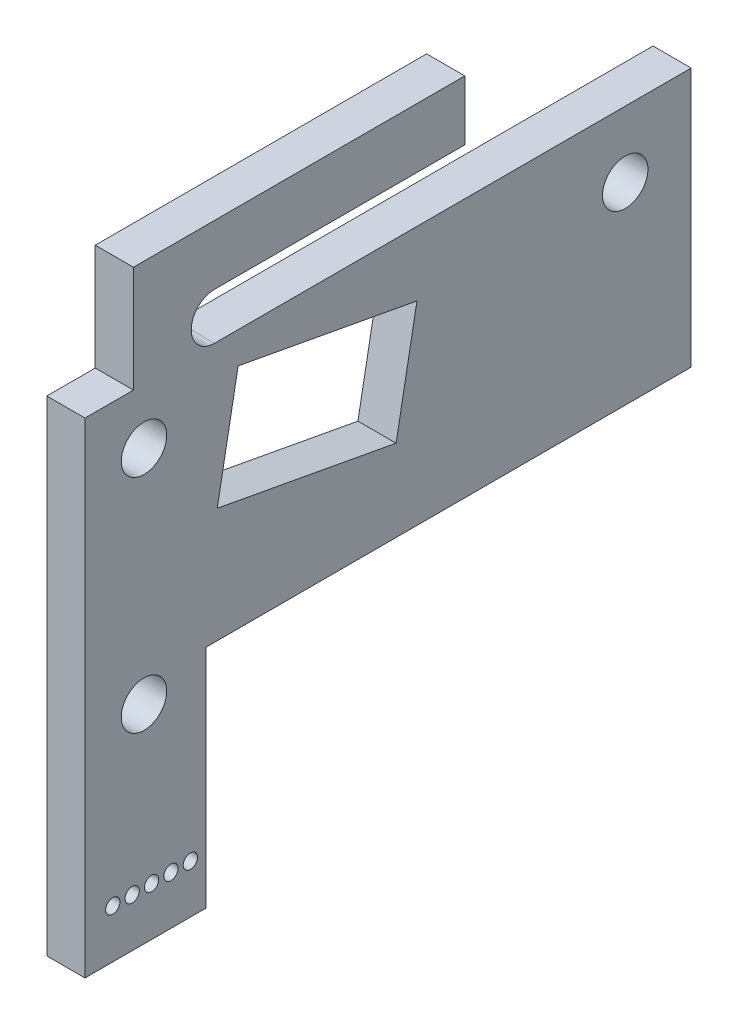
ISO-10303-21;
HEADER;
FILE_DESCRIPTION(('STEP AP214'),'2;1');
FILE_NAME('part.step','',(''),(''),'','','');
FILE_SCHEMA(('AUTOMOTIVE_DESIGN { 1 0 10303 214 1 1 1 1 }'));
ENDSEC;
DATA;
#1=APPLICATION_CONTEXT('core data for automotive mechanical design processes');
#2=APPLICATION_PROTOCOL_DEFINITION('international standard','automotive_design',2000,#1);
#3=PRODUCT_CONTEXT('',#1,'mechanical');
#4=PRODUCT('Part','Part','',(#3));
#5=PRODUCT_RELATED_PRODUCT_CATEGORY('part','',(#4));
#6=PRODUCT_DEFINITION_FORMATION('','',#4);
#7=PRODUCT_DEFINITION_CONTEXT('part definition',#1,'design');
#8=PRODUCT_DEFINITION('design','',#6,#7);
#9=PRODUCT_DEFINITION_SHAPE('','',#8);
#10=(LENGTH_UNIT() NAMED_UNIT(*) SI_UNIT(.MILLI.,.METRE.));
#11=(NAMED_UNIT(*) PLANE_ANGLE_UNIT() SI_UNIT($,.RADIAN.));
#12=(NAMED_UNIT(*) SI_UNIT($,.STERADIAN.) SOLID_ANGLE_UNIT());
#13=UNCERTAINTY_MEASURE_WITH_UNIT(LENGTH_MEASURE(1.E-05),#10,'distance_accuracy_value','');
#14=(GEOMETRIC_REPRESENTATION_CONTEXT(3) GLOBAL_UNCERTAINTY_ASSIGNED_CONTEXT((#13)) GLOBAL_UNIT_ASSIGNED_CONTEXT((#10,
#11,#12)) REPRESENTATION_CONTEXT('',''));
#15=CARTESIAN_POINT('',(0.,0.,0.));
#16=DIRECTION('',(0.,0.,1.));
#17=DIRECTION('',(1.,0.,0.));
#18=AXIS2_PLACEMENT_3D('',#15,#16,#17);
#19=CARTESIAN_POINT('',(2.,9.35346234385972,43.0185350255957));
#20=DIRECTION('',(-1.,0.,0.));
#21=DIRECTION('',(0.,0.,1.));
#22=AXIS2_PLACEMENT_3D('',#19,#20,#21);
#23=PLANE('',#22);
#24=CARTESIAN_POINT('',(2.,-38.8104127217883,53.6809582242048));
#25=DIRECTION('',(1.,0.,0.));
#26=DIRECTION('',(0.,0.,-1.));
#27=AXIS2_PLACEMENT_3D('',#24,#25,#26);
#28=CIRCLE('',#27,0.749999999999999);
#29=CARTESIAN_POINT('',(2.,-38.8104127217883,52.9309582242048));
#30=VERTEX_POINT('',#29);
#31=EDGE_CURVE('E186',#30,#30,#28,.T.);
#32=ORIENTED_EDGE('',*,*,#31,.F.);
#33=EDGE_LOOP('',(#32));
#34=FACE_BOUND('',#33,.T.);
#35=CARTESIAN_POINT('',(2.,0.,0.));
#36=DIRECTION('',(1.,0.,0.));
#37=DIRECTION('',(0.,0.,-1.));
#38=AXIS2_PLACEMENT_3D('',#35,#36,#37);
#39=CIRCLE('',#38,2.38125);
#40=CARTESIAN_POINT('',(2.,0.,-2.38125));
#41=VERTEX_POINT('',#40);
#42=EDGE_CURVE('E192',#41,#41,#39,.T.);
#43=ORIENTED_EDGE('',*,*,#42,.F.);
#44=EDGE_LOOP('',(#43));
#45=FACE_BOUND('',#44,.T.);
#46=DIRECTION('',(0.,-1.,0.));
#47=VECTOR('',#46,1.);
#48=CARTESIAN_POINT('',(2.,6.90958727821171,56.5904127217883));
#49=LINE('',#48,#47);
#50=CARTESIAN_POINT('',(2.,6.90958727821171,56.5904127217883));
#51=VERTEX_POINT('',#50);
#52=CARTESIAN_POINT('',(2.,-43.8904127217883,56.5904127217883));
#53=VERTEX_POINT('',#52);
#54=EDGE_CURVE('E198',#51,#53,#49,.T.);
#55=ORIENTED_EDGE('',*,*,#54,.T.);
#56=DIRECTION('',(0.,0.,-1.));
#57=VECTOR('',#56,1.);
#58=CARTESIAN_POINT('',(2.,-43.8904127217883,56.5904127217883));
#59=LINE('',#58,#57);
#60=CARTESIAN_POINT('',(2.,-43.8904127217883,43.8904127217883));
#61=VERTEX_POINT('',#60);
#62=EDGE_CURVE('E201',#53,#61,#59,.T.);
#63=ORIENTED_EDGE('',*,*,#62,.T.);
#64=DIRECTION('',(0.,1.,0.));
#65=VECTOR('',#64,1.);
#66=CARTESIAN_POINT('',(2.,-43.8904127217883,43.8904127217883));
#67=LINE('',#66,#65);
#68=CARTESIAN_POINT('',(2.,-20.2220575827776,43.8904127217883));
#69=VERTEX_POINT('',#68);
#70=EDGE_CURVE('E204',#61,#69,#67,.T.);
#71=ORIENTED_EDGE('',*,*,#70,.T.);
#72=DIRECTION('',(0.,0.,-1.));
#73=VECTOR('',#72,1.);
#74=CARTESIAN_POINT('',(2.,-20.2220575827776,43.8904127217883));
#75=LINE('',#74,#73);
#76=CARTESIAN_POINT('',(2.,-20.2220575827776,-6.90958727821172));
#77=VERTEX_POINT('',#76);
#78=EDGE_CURVE('E206',#69,#77,#75,.T.);
#79=ORIENTED_EDGE('',*,*,#78,.T.);
#80=DIRECTION('',(0.,1.,0.));
#81=VECTOR('',#80,1.);
#82=CARTESIAN_POINT('',(2.,-20.2220575827776,-6.90958727821172));
#83=LINE('',#82,#81);
#84=CARTESIAN_POINT('',(2.,6.90958727821172,-6.90958727821172));
#85=VERTEX_POINT('',#84);
#86=EDGE_CURVE('E208',#77,#85,#83,.T.);
#87=ORIENTED_EDGE('',*,*,#86,.T.);
#88=DIRECTION('',(0.,0.,1.));
#89=VECTOR('',#88,1.);
#90=CARTESIAN_POINT('',(2.,6.90958727821171,43.0185350255957));
#91=LINE('',#90,#89);
#92=CARTESIAN_POINT('',(2.,6.90958727821171,43.0185350255957));
#93=VERTEX_POINT('',#92);
#94=EDGE_CURVE('E210',#85,#93,#91,.T.);
#95=ORIENTED_EDGE('',*,*,#94,.T.);
#96=CARTESIAN_POINT('',(2.,9.35346234385972,43.0185350255957));
#97=DIRECTION('',(-1.,0.,0.));
#98=DIRECTION('',(0.,0.,1.));
#99=AXIS2_PLACEMENT_3D('',#96,#97,#98);
#100=CIRCLE('',#99,2.443875065648);
#101=CARTESIAN_POINT('',(2.,11.7973374095077,43.0185350255957));
#102=VERTEX_POINT('',#101);
#103=EDGE_CURVE('E212',#93,#102,#100,.T.);
#104=ORIENTED_EDGE('',*,*,#103,.T.);
#105=DIRECTION('',(0.,0.,-1.));
#106=VECTOR('',#105,1.);
#107=CARTESIAN_POINT('',(2.,11.7973374095077,43.0185350255957));
#108=LINE('',#107,#106);
#109=CARTESIAN_POINT('',(2.,11.7973374095077,16.8039920927754));
#110=VERTEX_POINT('',#109);
#111=EDGE_CURVE('E214',#102,#110,#108,.T.);
#112=ORIENTED_EDGE('',*,*,#111,.T.);
#113=DIRECTION('',(0.,1.,0.));
#114=VECTOR('',#113,1.);
#115=CARTESIAN_POINT('',(2.,11.7973374095077,16.8039920927754));
#116=LINE('',#115,#114);
#117=CARTESIAN_POINT('',(2.,18.0537156021804,16.8039920927754));
#118=VERTEX_POINT('',#117);
#119=EDGE_CURVE('E216',#110,#118,#116,.T.);
#120=ORIENTED_EDGE('',*,*,#119,.T.);
#121=DIRECTION('',(0.,0.,1.));
#122=VECTOR('',#121,1.);
#123=CARTESIAN_POINT('',(2.,18.0537156021804,16.8039920927754));
#124=LINE('',#123,#122);
#125=CARTESIAN_POINT('',(2.,18.0537156021804,51.5186087794746));
#126=VERTEX_POINT('',#125);
#127=EDGE_CURVE('E218',#118,#126,#124,.T.);
#128=ORIENTED_EDGE('',*,*,#127,.T.);
#129=DIRECTION('',(0.,-1.,0.));
#130=VECTOR('',#129,1.);
#131=CARTESIAN_POINT('',(2.,18.0537156021804,51.5186087794746));
#132=LINE('',#131,#130);
#133=CARTESIAN_POINT('',(2.,6.90958727821171,51.5186087794746));
#134=VERTEX_POINT('',#133);
#135=EDGE_CURVE('E220',#126,#134,#132,.T.);
#136=ORIENTED_EDGE('',*,*,#135,.T.);
#137=DIRECTION('',(0.,0.,1.));
#138=VECTOR('',#137,1.);
#139=CARTESIAN_POINT('',(2.,6.90958727821171,56.5904127217883));
#140=LINE('',#139,#138);
#141=EDGE_CURVE('E222',#134,#51,#140,.T.);
#142=ORIENTED_EDGE('',*,*,#141,.T.);
#143=EDGE_LOOP('',(#55,#63,#71,#79,#87,#95,#104,#112,#120,#128,#136,#142));
#144=FACE_BOUND('',#143,.T.);
#145=DIRECTION('',(0.,-0.983319763651573,0.181885245174571));
#146=VECTOR('',#145,1.);
#147=CARTESIAN_POINT('',(2.,3.61240817228016,40.5478550171507));
#148=LINE('',#147,#146);
#149=CARTESIAN_POINT('',(2.,3.61240817228016,40.5478550171507));
#150=VERTEX_POINT('',#149);
#151=CARTESIAN_POINT('',(2.,-8.20328656154539,42.73341114346));
#152=VERTEX_POINT('',#151);
#153=EDGE_CURVE('E147',#150,#152,#148,.T.);
#154=ORIENTED_EDGE('',*,*,#153,.F.);
#155=DIRECTION('',(0.,0.181885245174571,0.983319763651574));
#156=VECTOR('',#155,1.);
#157=CARTESIAN_POINT('',(2.,3.61240817228016,40.5478550171507));
#158=LINE('',#157,#156);
#159=CARTESIAN_POINT('',(2.,0.147494251704591,21.8156135195882));
#160=VERTEX_POINT('',#159);
#161=EDGE_CURVE('E170',#160,#150,#158,.T.);
#162=ORIENTED_EDGE('',*,*,#161,.F.);
#163=DIRECTION('',(0.,0.983319763651573,-0.181885245174571));
#164=VECTOR('',#163,1.);
#165=CARTESIAN_POINT('',(2.,0.147494251704591,21.8156135195882));
#166=LINE('',#165,#164);
#167=CARTESIAN_POINT('',(2.,-11.668200482121,24.0011696458975));
#168=VERTEX_POINT('',#167);
#169=EDGE_CURVE('E168',#168,#160,#166,.T.);
#170=ORIENTED_EDGE('',*,*,#169,.F.);
#171=DIRECTION('',(0.,-0.181885245174571,-0.983319763651574));
#172=VECTOR('',#171,1.);
#173=CARTESIAN_POINT('',(2.,-8.20328656154539,42.73341114346));
#174=LINE('',#173,#172);
#175=EDGE_CURVE('E155',#152,#168,#174,.T.);
#176=ORIENTED_EDGE('',*,*,#175,.F.);
#177=EDGE_LOOP('',(#154,#162,#170,#176));
#178=FACE_BOUND('',#177,.T.);
#179=CARTESIAN_POINT('',(2.,-38.8104127217883,45.5529582242048));
#180=DIRECTION('',(1.,0.,0.));
#181=DIRECTION('',(0.,0.,-1.));
#182=AXIS2_PLACEMENT_3D('',#179,#180,#181);
#183=CIRCLE('',#182,0.749999999999999);
#184=CARTESIAN_POINT('',(2.,-38.8104127217883,44.8029582242048));
#185=VERTEX_POINT('',#184);
#186=EDGE_CURVE('E176',#185,#185,#183,.T.);
#187=ORIENTED_EDGE('',*,*,#186,.F.);
#188=EDGE_LOOP('',(#187));
#189=FACE_BOUND('',#188,.T.);
#190=CARTESIAN_POINT('',(2.,-22.137211246104,50.4101289105847));
#191=DIRECTION('',(1.,0.,0.));
#192=DIRECTION('',(0.,0.,-1.));
#193=AXIS2_PLACEMENT_3D('',#190,#191,#192);
#194=CIRCLE('',#193,2.38125);
#195=CARTESIAN_POINT('',(2.,-22.137211246104,48.0288789105847));
#196=VERTEX_POINT('',#195);
#197=EDGE_CURVE('E597',#196,#196,#194,.T.);
#198=ORIENTED_EDGE('',*,*,#197,.F.);
#199=EDGE_LOOP('',(#198));
#200=FACE_BOUND('',#199,.T.);
#201=CARTESIAN_POINT('',(2.,-38.8104127217883,47.5849582242048));
#202=DIRECTION('',(1.,0.,0.));
#203=DIRECTION('',(0.,0.,-1.));
#204=AXIS2_PLACEMENT_3D('',#201,#202,#203);
#205=CIRCLE('',#204,0.749999999999999);
#206=CARTESIAN_POINT('',(2.,-38.8104127217883,46.8349582242048));
#207=VERTEX_POINT('',#206);
#208=EDGE_CURVE('E591',#207,#207,#205,.T.);
#209=ORIENTED_EDGE('',*,*,#208,.F.);
#210=EDGE_LOOP('',(#209));
#211=FACE_BOUND('',#210,.T.);
#212=CARTESIAN_POINT('',(2.,-38.8104127217883,49.6169582242048));
#213=DIRECTION('',(1.,0.,0.));
#214=DIRECTION('',(0.,0.,-1.));
#215=AXIS2_PLACEMENT_3D('',#212,#213,#214);
#216=CIRCLE('',#215,0.749999999999999);
#217=CARTESIAN_POINT('',(2.,-38.8104127217883,48.8669582242048));
#218=VERTEX_POINT('',#217);
#219=EDGE_CURVE('E585',#218,#218,#216,.T.);
#220=ORIENTED_EDGE('',*,*,#219,.F.);
#221=EDGE_LOOP('',(#220));
#222=FACE_BOUND('',#221,.T.);
#223=CARTESIAN_POINT('',(2.,-38.8104127217883,51.6489582242048));
#224=DIRECTION('',(1.,0.,0.));
#225=DIRECTION('',(0.,0.,-1.));
#226=AXIS2_PLACEMENT_3D('',#223,#224,#225);
#227=CIRCLE('',#226,0.749999999999999);
#228=CARTESIAN_POINT('',(2.,-38.8104127217883,50.8989582242048));
#229=VERTEX_POINT('',#228);
#230=EDGE_CURVE('E579',#229,#229,#227,.T.);
#231=ORIENTED_EDGE('',*,*,#230,.F.);
#232=EDGE_LOOP('',(#231));
#233=FACE_BOUND('',#232,.T.);
#234=CARTESIAN_POINT('',(2.,1.07937569190719,50.4101289105847));
#235=DIRECTION('',(1.,0.,0.));
#236=DIRECTION('',(0.,0.,-1.));
#237=AXIS2_PLACEMENT_3D('',#234,#235,#236);
#238=CIRCLE('',#237,2.38125);
#239=CARTESIAN_POINT('',(2.,1.07937569190719,48.0288789105847));
#240=VERTEX_POINT('',#239);
#241=EDGE_CURVE('E570',#240,#240,#238,.T.);
#242=ORIENTED_EDGE('',*,*,#241,.F.);
#243=EDGE_LOOP('',(#242));
#244=FACE_BOUND('',#243,.T.);
#245=ADVANCED_FACE('F34',(#34,#45,#144,#178,#189,#200,#211,#222,#233,#244),#23,.F.);
#246=CARTESIAN_POINT('',(-2.,9.35346234385972,43.0185350255957));
#247=DIRECTION('',(-1.,0.,0.));
#248=DIRECTION('',(0.,0.,1.));
#249=AXIS2_PLACEMENT_3D('',#246,#247,#248);
#250=PLANE('',#249);
#251=CARTESIAN_POINT('',(-2.,-38.8104127217883,51.6489582242048));
#252=DIRECTION('',(1.,0.,0.));
#253=DIRECTION('',(0.,0.,-1.));
#254=AXIS2_PLACEMENT_3D('',#251,#252,#253);
#255=CIRCLE('',#254,0.749999999999999);
#256=CARTESIAN_POINT('',(-2.,-38.8104127217883,50.8989582242048));
#257=VERTEX_POINT('',#256);
#258=EDGE_CURVE('E576',#257,#257,#255,.T.);
#259=ORIENTED_EDGE('',*,*,#258,.T.);
#260=EDGE_LOOP('',(#259));
#261=FACE_BOUND('',#260,.T.);
#262=CARTESIAN_POINT('',(-2.,-38.8104127217883,47.5849582242048));
#263=DIRECTION('',(1.,0.,0.));
#264=DIRECTION('',(0.,0.,-1.));
#265=AXIS2_PLACEMENT_3D('',#262,#263,#264);
#266=CIRCLE('',#265,0.749999999999999);
#267=CARTESIAN_POINT('',(-2.,-38.8104127217883,46.8349582242048));
#268=VERTEX_POINT('',#267);
#269=EDGE_CURVE('E588',#268,#268,#266,.T.);
#270=ORIENTED_EDGE('',*,*,#269,.T.);
#271=EDGE_LOOP('',(#270));
#272=FACE_BOUND('',#271,.T.);
#273=CARTESIAN_POINT('',(-2.,-38.8104127217883,45.5529582242048));
#274=DIRECTION('',(1.,0.,0.));
#275=DIRECTION('',(0.,0.,-1.));
#276=AXIS2_PLACEMENT_3D('',#273,#274,#275);
#277=CIRCLE('',#276,0.749999999999999);
#278=CARTESIAN_POINT('',(-2.,-38.8104127217883,44.8029582242048));
#279=VERTEX_POINT('',#278);
#280=EDGE_CURVE('E600',#279,#279,#277,.T.);
#281=ORIENTED_EDGE('',*,*,#280,.T.);
#282=EDGE_LOOP('',(#281));
#283=FACE_BOUND('',#282,.T.);
#284=CARTESIAN_POINT('',(-2.,0.,0.));
#285=DIRECTION('',(1.,0.,0.));
#286=DIRECTION('',(0.,0.,-1.));
#287=AXIS2_PLACEMENT_3D('',#284,#285,#286);
#288=CIRCLE('',#287,2.38125);
#289=CARTESIAN_POINT('',(-2.,0.,-2.38125));
#290=VERTEX_POINT('',#289);
#291=EDGE_CURVE('E189',#290,#290,#288,.T.);
#292=ORIENTED_EDGE('',*,*,#291,.T.);
#293=EDGE_LOOP('',(#292));
#294=FACE_BOUND('',#293,.T.);
#295=DIRECTION('',(0.,-1.,0.));
#296=VECTOR('',#295,1.);
#297=CARTESIAN_POINT('',(-2.,6.90958727821171,56.5904127217883));
#298=LINE('',#297,#296);
#299=CARTESIAN_POINT('',(-2.,6.90958727821171,56.5904127217883));
#300=VERTEX_POINT('',#299);
#301=CARTESIAN_POINT('',(-2.,-43.8904127217883,56.5904127217883));
#302=VERTEX_POINT('',#301);
#303=EDGE_CURVE('E195',#300,#302,#298,.T.);
#304=ORIENTED_EDGE('',*,*,#303,.F.);
#305=DIRECTION('',(0.,0.,1.));
#306=VECTOR('',#305,1.);
#307=CARTESIAN_POINT('',(-2.,6.90958727821171,56.5904127217883));
#308=LINE('',#307,#306);
#309=CARTESIAN_POINT('',(-2.,6.90958727821171,51.5186087794746));
#310=VERTEX_POINT('',#309);
#311=EDGE_CURVE('E202',#310,#300,#308,.T.);
#312=ORIENTED_EDGE('',*,*,#311,.F.);
#313=DIRECTION('',(0.,-1.,0.));
#314=VECTOR('',#313,1.);
#315=CARTESIAN_POINT('',(-2.,18.0537156021804,51.5186087794746));
#316=LINE('',#315,#314);
#317=CARTESIAN_POINT('',(-2.,18.0537156021804,51.5186087794746));
#318=VERTEX_POINT('',#317);
#319=EDGE_CURVE('E245',#318,#310,#316,.T.);
#320=ORIENTED_EDGE('',*,*,#319,.F.);
#321=DIRECTION('',(0.,0.,1.));
#322=VECTOR('',#321,1.);
#323=CARTESIAN_POINT('',(-2.,18.0537156021804,16.8039920927754));
#324=LINE('',#323,#322);
#325=CARTESIAN_POINT('',(-2.,18.0537156021804,16.8039920927754));
#326=VERTEX_POINT('',#325);
#327=EDGE_CURVE('E243',#326,#318,#324,.T.);
#328=ORIENTED_EDGE('',*,*,#327,.F.);
#329=DIRECTION('',(0.,1.,0.));
#330=VECTOR('',#329,1.);
#331=CARTESIAN_POINT('',(-2.,11.7973374095077,16.8039920927754));
#332=LINE('',#331,#330);
#333=CARTESIAN_POINT('',(-2.,11.7973374095077,16.8039920927754));
#334=VERTEX_POINT('',#333);
#335=EDGE_CURVE('E241',#334,#326,#332,.T.);
#336=ORIENTED_EDGE('',*,*,#335,.F.);
#337=DIRECTION('',(0.,0.,-1.));
#338=VECTOR('',#337,1.);
#339=CARTESIAN_POINT('',(-2.,11.7973374095077,43.0185350255957));
#340=LINE('',#339,#338);
#341=CARTESIAN_POINT('',(-2.,11.7973374095077,43.0185350255957));
#342=VERTEX_POINT('',#341);
#343=EDGE_CURVE('E239',#342,#334,#340,.T.);
#344=ORIENTED_EDGE('',*,*,#343,.F.);
#345=CARTESIAN_POINT('',(-2.,9.35346234385972,43.0185350255957));
#346=DIRECTION('',(-1.,0.,0.));
#347=DIRECTION('',(0.,0.,1.));
#348=AXIS2_PLACEMENT_3D('',#345,#346,#347);
#349=CIRCLE('',#348,2.443875065648);
#350=CARTESIAN_POINT('',(-2.,6.90958727821171,43.0185350255957));
#351=VERTEX_POINT('',#350);
#352=EDGE_CURVE('E237',#351,#342,#349,.T.);
#353=ORIENTED_EDGE('',*,*,#352,.F.);
#354=DIRECTION('',(0.,0.,1.));
#355=VECTOR('',#354,1.);
#356=CARTESIAN_POINT('',(-2.,6.90958727821171,43.0185350255957));
#357=LINE('',#356,#355);
#358=CARTESIAN_POINT('',(-2.,6.90958727821172,-6.90958727821172));
#359=VERTEX_POINT('',#358);
#360=EDGE_CURVE('E235',#359,#351,#357,.T.);
#361=ORIENTED_EDGE('',*,*,#360,.F.);
#362=DIRECTION('',(0.,1.,0.));
#363=VECTOR('',#362,1.);
#364=CARTESIAN_POINT('',(-2.,-20.2220575827776,-6.90958727821172));
#365=LINE('',#364,#363);
#366=CARTESIAN_POINT('',(-2.,-20.2220575827776,-6.90958727821172));
#367=VERTEX_POINT('',#366);
#368=EDGE_CURVE('E233',#367,#359,#365,.T.);
#369=ORIENTED_EDGE('',*,*,#368,.F.);
#370=DIRECTION('',(0.,0.,-1.));
#371=VECTOR('',#370,1.);
#372=CARTESIAN_POINT('',(-2.,-20.2220575827776,43.8904127217883));
#373=LINE('',#372,#371);
#374=CARTESIAN_POINT('',(-2.,-20.2220575827776,43.8904127217883));
#375=VERTEX_POINT('',#374);
#376=EDGE_CURVE('E231',#375,#367,#373,.T.);
#377=ORIENTED_EDGE('',*,*,#376,.F.);
#378=DIRECTION('',(0.,1.,0.));
#379=VECTOR('',#378,1.);
#380=CARTESIAN_POINT('',(-2.,-43.8904127217883,43.8904127217883));
#381=LINE('',#380,#379);
#382=CARTESIAN_POINT('',(-2.,-43.8904127217883,43.8904127217883));
#383=VERTEX_POINT('',#382);
#384=EDGE_CURVE('E229',#383,#375,#381,.T.);
#385=ORIENTED_EDGE('',*,*,#384,.F.);
#386=DIRECTION('',(0.,0.,-1.));
#387=VECTOR('',#386,1.);
#388=CARTESIAN_POINT('',(-2.,-43.8904127217883,56.5904127217883));
#389=LINE('',#388,#387);
#390=EDGE_CURVE('E227',#302,#383,#389,.T.);
#391=ORIENTED_EDGE('',*,*,#390,.F.);
#392=EDGE_LOOP('',(#304,#312,#320,#328,#336,#344,#353,#361,#369,#377,#385,#391));
#393=FACE_BOUND('',#392,.T.);
#394=CARTESIAN_POINT('',(-2.,-38.8104127217883,53.6809582242048));
#395=DIRECTION('',(1.,0.,0.));
#396=DIRECTION('',(0.,0.,-1.));
#397=AXIS2_PLACEMENT_3D('',#394,#395,#396);
#398=CIRCLE('',#397,0.749999999999999);
#399=CARTESIAN_POINT('',(-2.,-38.8104127217883,52.9309582242048));
#400=VERTEX_POINT('',#399);
#401=EDGE_CURVE('E163',#400,#400,#398,.T.);
#402=ORIENTED_EDGE('',*,*,#401,.T.);
#403=EDGE_LOOP('',(#402));
#404=FACE_BOUND('',#403,.T.);
#405=DIRECTION('',(0.,0.181885245174571,0.983319763651574));
#406=VECTOR('',#405,1.);
#407=CARTESIAN_POINT('',(-2.,3.61240817228016,40.5478550171507));
#408=LINE('',#407,#406);
#409=CARTESIAN_POINT('',(-2.,0.147494251704591,21.8156135195882));
#410=VERTEX_POINT('',#409);
#411=CARTESIAN_POINT('',(-2.,3.61240817228016,40.5478550171507));
#412=VERTEX_POINT('',#411);
#413=EDGE_CURVE('E156',#410,#412,#408,.T.);
#414=ORIENTED_EDGE('',*,*,#413,.T.);
#415=DIRECTION('',(0.,-0.983319763651573,0.181885245174571));
#416=VECTOR('',#415,1.);
#417=CARTESIAN_POINT('',(-2.,3.61240817228016,40.5478550171507));
#418=LINE('',#417,#416);
#419=CARTESIAN_POINT('',(-2.,-8.20328656154539,42.73341114346));
#420=VERTEX_POINT('',#419);
#421=EDGE_CURVE('E57',#412,#420,#418,.T.);
#422=ORIENTED_EDGE('',*,*,#421,.T.);
#423=DIRECTION('',(0.,-0.181885245174571,-0.983319763651574));
#424=VECTOR('',#423,1.);
#425=CARTESIAN_POINT('',(-2.,-8.20328656154539,42.73341114346));
#426=LINE('',#425,#424);
#427=CARTESIAN_POINT('',(-2.,-11.668200482121,24.0011696458975));
#428=VERTEX_POINT('',#427);
#429=EDGE_CURVE('E162',#420,#428,#426,.T.);
#430=ORIENTED_EDGE('',*,*,#429,.T.);
#431=DIRECTION('',(0.,0.983319763651573,-0.181885245174571));
#432=VECTOR('',#431,1.);
#433=CARTESIAN_POINT('',(-2.,0.147494251704591,21.8156135195882));
#434=LINE('',#433,#432);
#435=EDGE_CURVE('E178',#428,#410,#434,.T.);
#436=ORIENTED_EDGE('',*,*,#435,.T.);
#437=EDGE_LOOP('',(#414,#422,#430,#436));
#438=FACE_BOUND('',#437,.T.);
#439=CARTESIAN_POINT('',(-2.,-22.137211246104,50.4101289105847));
#440=DIRECTION('',(1.,0.,0.));
#441=DIRECTION('',(0.,0.,-1.));
#442=AXIS2_PLACEMENT_3D('',#439,#440,#441);
#443=CIRCLE('',#442,2.38125);
#444=CARTESIAN_POINT('',(-2.,-22.137211246104,48.0288789105847));
#445=VERTEX_POINT('',#444);
#446=EDGE_CURVE('E594',#445,#445,#443,.T.);
#447=ORIENTED_EDGE('',*,*,#446,.T.);
#448=EDGE_LOOP('',(#447));
#449=FACE_BOUND('',#448,.T.);
#450=CARTESIAN_POINT('',(-2.,-38.8104127217883,49.6169582242048));
#451=DIRECTION('',(1.,0.,0.));
#452=DIRECTION('',(0.,0.,-1.));
#453=AXIS2_PLACEMENT_3D('',#450,#451,#452);
#454=CIRCLE('',#453,0.749999999999999);
#455=CARTESIAN_POINT('',(-2.,-38.8104127217883,48.8669582242048));
#456=VERTEX_POINT('',#455);
#457=EDGE_CURVE('E582',#456,#456,#454,.T.);
#458=ORIENTED_EDGE('',*,*,#457,.T.);
#459=EDGE_LOOP('',(#458));
#460=FACE_BOUND('',#459,.T.);
#461=CARTESIAN_POINT('',(-2.,1.07937569190719,50.4101289105847));
#462=DIRECTION('',(1.,0.,0.));
#463=DIRECTION('',(0.,0.,-1.));
#464=AXIS2_PLACEMENT_3D('',#461,#462,#463);
#465=CIRCLE('',#464,2.38125);
#466=CARTESIAN_POINT('',(-2.,1.07937569190719,48.0288789105847));
#467=VERTEX_POINT('',#466);
#468=EDGE_CURVE('E573',#467,#467,#465,.T.);
#469=ORIENTED_EDGE('',*,*,#468,.T.);
#470=EDGE_LOOP('',(#469));
#471=FACE_BOUND('',#470,.T.);
#472=ADVANCED_FACE('F287',(#261,#272,#283,#294,#393,#404,#438,#449,#460,#471),#250,.T.);
#473=CARTESIAN_POINT('',(2.,6.90958727821171,56.5904127217883));
#474=DIRECTION('',(0.,0.,-1.));
#475=DIRECTION('',(0.,1.,0.));
#476=AXIS2_PLACEMENT_3D('',#473,#474,#475);
#477=PLANE('',#476);
#478=ORIENTED_EDGE('',*,*,#303,.T.);
#479=DIRECTION('',(-1.,0.,0.));
#480=VECTOR('',#479,1.);
#481=CARTESIAN_POINT('',(2.,-43.8904127217883,56.5904127217883));
#482=LINE('',#481,#480);
#483=EDGE_CURVE('E11',#53,#302,#482,.T.);
#484=ORIENTED_EDGE('',*,*,#483,.F.);
#485=ORIENTED_EDGE('',*,*,#54,.F.);
#486=DIRECTION('',(-1.,0.,0.));
#487=VECTOR('',#486,1.);
#488=CARTESIAN_POINT('',(2.,6.90958727821171,56.5904127217883));
#489=LINE('',#488,#487);
#490=EDGE_CURVE('E224',#51,#300,#489,.T.);
#491=ORIENTED_EDGE('',*,*,#490,.T.);
#492=EDGE_LOOP('',(#478,#484,#485,#491));
#493=FACE_BOUND('',#492,.T.);
#494=ADVANCED_FACE('F36',(#493),#477,.F.);
#495=CARTESIAN_POINT('',(2.,-43.8904127217883,56.5904127217883));
#496=DIRECTION('',(0.,1.,0.));
#497=DIRECTION('',(0.,0.,1.));
#498=AXIS2_PLACEMENT_3D('',#495,#496,#497);
#499=PLANE('',#498);
#500=ORIENTED_EDGE('',*,*,#390,.T.);
#501=DIRECTION('',(-1.,0.,0.));
#502=VECTOR('',#501,1.);
#503=CARTESIAN_POINT('',(2.,-43.8904127217883,43.8904127217883));
#504=LINE('',#503,#502);
#505=EDGE_CURVE('E42',#61,#383,#504,.T.);
#506=ORIENTED_EDGE('',*,*,#505,.F.);
#507=ORIENTED_EDGE('',*,*,#62,.F.);
#508=ORIENTED_EDGE('',*,*,#483,.T.);
#509=EDGE_LOOP('',(#500,#506,#507,#508));
#510=FACE_BOUND('',#509,.T.);
#511=ADVANCED_FACE('F304',(#510),#499,.F.);
#512=CARTESIAN_POINT('',(2.,-43.8904127217883,43.8904127217883));
#513=DIRECTION('',(0.,0.,1.));
#514=DIRECTION('',(1.,0.,0.));
#515=AXIS2_PLACEMENT_3D('',#512,#513,#514);
#516=PLANE('',#515);
#517=ORIENTED_EDGE('',*,*,#384,.T.);
#518=DIRECTION('',(-1.,0.,0.));
#519=VECTOR('',#518,1.);
#520=CARTESIAN_POINT('',(2.,-20.2220575827776,43.8904127217883));
#521=LINE('',#520,#519);
#522=EDGE_CURVE('E274',#69,#375,#521,.T.);
#523=ORIENTED_EDGE('',*,*,#522,.F.);
#524=ORIENTED_EDGE('',*,*,#70,.F.);
#525=ORIENTED_EDGE('',*,*,#505,.T.);
#526=EDGE_LOOP('',(#517,#523,#524,#525));
#527=FACE_BOUND('',#526,.T.);
#528=ADVANCED_FACE('F281',(#527),#516,.F.);
#529=CARTESIAN_POINT('',(2.,-20.2220575827776,43.8904127217883));
#530=DIRECTION('',(0.,1.,0.));
#531=DIRECTION('',(0.,0.,1.));
#532=AXIS2_PLACEMENT_3D('',#529,#530,#531);
#533=PLANE('',#532);
#534=ORIENTED_EDGE('',*,*,#376,.T.);
#535=DIRECTION('',(-1.,0.,0.));
#536=VECTOR('',#535,1.);
#537=CARTESIAN_POINT('',(2.,-20.2220575827776,-6.90958727821172));
#538=LINE('',#537,#536);
#539=EDGE_CURVE('E271',#77,#367,#538,.T.);
#540=ORIENTED_EDGE('',*,*,#539,.F.);
#541=ORIENTED_EDGE('',*,*,#78,.F.);
#542=ORIENTED_EDGE('',*,*,#522,.T.);
#543=EDGE_LOOP('',(#534,#540,#541,#542));
#544=FACE_BOUND('',#543,.T.);
#545=ADVANCED_FACE('F293',(#544),#533,.F.);
#546=CARTESIAN_POINT('',(2.,-20.2220575827776,-6.90958727821172));
#547=DIRECTION('',(0.,0.,1.));
#548=DIRECTION('',(1.,0.,0.));
#549=AXIS2_PLACEMENT_3D('',#546,#547,#548);
#550=PLANE('',#549);
#551=ORIENTED_EDGE('',*,*,#368,.T.);
#552=DIRECTION('',(-1.,0.,0.));
#553=VECTOR('',#552,1.);
#554=CARTESIAN_POINT('',(2.,6.90958727821172,-6.90958727821172));
#555=LINE('',#554,#553);
#556=EDGE_CURVE('E268',#85,#359,#555,.T.);
#557=ORIENTED_EDGE('',*,*,#556,.F.);
#558=ORIENTED_EDGE('',*,*,#86,.F.);
#559=ORIENTED_EDGE('',*,*,#539,.T.);
#560=EDGE_LOOP('',(#551,#557,#558,#559));
#561=FACE_BOUND('',#560,.T.);
#562=ADVANCED_FACE('F297',(#561),#550,.F.);
#563=CARTESIAN_POINT('',(2.,6.90958727821171,43.0185350255957));
#564=DIRECTION('',(0.,-1.,0.));
#565=DIRECTION('',(0.,0.,-1.));
#566=AXIS2_PLACEMENT_3D('',#563,#564,#565);
#567=PLANE('',#566);
#568=ORIENTED_EDGE('',*,*,#360,.T.);
#569=DIRECTION('',(-1.,0.,0.));
#570=VECTOR('',#569,1.);
#571=CARTESIAN_POINT('',(2.,6.90958727821171,43.0185350255957));
#572=LINE('',#571,#570);
#573=EDGE_CURVE('E265',#93,#351,#572,.T.);
#574=ORIENTED_EDGE('',*,*,#573,.F.);
#575=ORIENTED_EDGE('',*,*,#94,.F.);
#576=ORIENTED_EDGE('',*,*,#556,.T.);
#577=EDGE_LOOP('',(#568,#574,#575,#576));
#578=FACE_BOUND('',#577,.T.);
#579=ADVANCED_FACE('F337',(#578),#567,.F.);
#580=CARTESIAN_POINT('',(2.,9.35346234385972,43.0185350255957));
#581=DIRECTION('',(-1.,0.,0.));
#582=DIRECTION('',(0.,0.,1.));
#583=AXIS2_PLACEMENT_3D('',#580,#581,#582);
#584=CYLINDRICAL_SURFACE('',#583,2.443875065648);
#585=ORIENTED_EDGE('',*,*,#352,.T.);
#586=DIRECTION('',(-1.,0.,0.));
#587=VECTOR('',#586,1.);
#588=CARTESIAN_POINT('',(2.,11.7973374095077,43.0185350255957));
#589=LINE('',#588,#587);
#590=EDGE_CURVE('E262',#102,#342,#589,.T.);
#591=ORIENTED_EDGE('',*,*,#590,.F.);
#592=ORIENTED_EDGE('',*,*,#103,.F.);
#593=ORIENTED_EDGE('',*,*,#573,.T.);
#594=EDGE_LOOP('',(#585,#591,#592,#593));
#595=FACE_BOUND('',#594,.T.);
#596=ADVANCED_FACE('F335',(#595),#584,.F.);
#597=CARTESIAN_POINT('',(2.,11.7973374095077,43.0185350255957));
#598=DIRECTION('',(0.,1.,0.));
#599=DIRECTION('',(0.,0.,1.));
#600=AXIS2_PLACEMENT_3D('',#597,#598,#599);
#601=PLANE('',#600);
#602=ORIENTED_EDGE('',*,*,#343,.T.);
#603=DIRECTION('',(-1.,0.,0.));
#604=VECTOR('',#603,1.);
#605=CARTESIAN_POINT('',(2.,11.7973374095077,16.8039920927754));
#606=LINE('',#605,#604);
#607=EDGE_CURVE('E259',#110,#334,#606,.T.);
#608=ORIENTED_EDGE('',*,*,#607,.F.);
#609=ORIENTED_EDGE('',*,*,#111,.F.);
#610=ORIENTED_EDGE('',*,*,#590,.T.);
#611=EDGE_LOOP('',(#602,#608,#609,#610));
#612=FACE_BOUND('',#611,.T.);
#613=ADVANCED_FACE('F331',(#612),#601,.F.);
#614=CARTESIAN_POINT('',(2.,11.7973374095077,16.8039920927754));
#615=DIRECTION('',(0.,0.,1.));
#616=DIRECTION('',(1.,0.,0.));
#617=AXIS2_PLACEMENT_3D('',#614,#615,#616);
#618=PLANE('',#617);
#619=ORIENTED_EDGE('',*,*,#335,.T.);
#620=DIRECTION('',(-1.,0.,0.));
#621=VECTOR('',#620,1.);
#622=CARTESIAN_POINT('',(2.,18.0537156021804,16.8039920927754));
#623=LINE('',#622,#621);
#624=EDGE_CURVE('E256',#118,#326,#623,.T.);
#625=ORIENTED_EDGE('',*,*,#624,.F.);
#626=ORIENTED_EDGE('',*,*,#119,.F.);
#627=ORIENTED_EDGE('',*,*,#607,.T.);
#628=EDGE_LOOP('',(#619,#625,#626,#627));
#629=FACE_BOUND('',#628,.T.);
#630=ADVANCED_FACE('F326',(#629),#618,.F.);
#631=CARTESIAN_POINT('',(2.,18.0537156021804,16.8039920927754));
#632=DIRECTION('',(0.,-1.,0.));
#633=DIRECTION('',(0.,0.,-1.));
#634=AXIS2_PLACEMENT_3D('',#631,#632,#633);
#635=PLANE('',#634);
#636=ORIENTED_EDGE('',*,*,#327,.T.);
#637=DIRECTION('',(-1.,0.,0.));
#638=VECTOR('',#637,1.);
#639=CARTESIAN_POINT('',(2.,18.0537156021804,51.5186087794746));
#640=LINE('',#639,#638);
#641=EDGE_CURVE('E253',#126,#318,#640,.T.);
#642=ORIENTED_EDGE('',*,*,#641,.F.);
#643=ORIENTED_EDGE('',*,*,#127,.F.);
#644=ORIENTED_EDGE('',*,*,#624,.T.);
#645=EDGE_LOOP('',(#636,#642,#643,#644));
#646=FACE_BOUND('',#645,.T.);
#647=ADVANCED_FACE('F320',(#646),#635,.F.);
#648=CARTESIAN_POINT('',(2.,18.0537156021804,51.5186087794746));
#649=DIRECTION('',(0.,0.,-1.));
#650=DIRECTION('',(-1.,0.,0.));
#651=AXIS2_PLACEMENT_3D('',#648,#649,#650);
#652=PLANE('',#651);
#653=ORIENTED_EDGE('',*,*,#319,.T.);
#654=DIRECTION('',(-1.,0.,0.));
#655=VECTOR('',#654,1.);
#656=CARTESIAN_POINT('',(2.,6.90958727821171,51.5186087794746));
#657=LINE('',#656,#655);
#658=EDGE_CURVE('E250',#134,#310,#657,.T.);
#659=ORIENTED_EDGE('',*,*,#658,.F.);
#660=ORIENTED_EDGE('',*,*,#135,.F.);
#661=ORIENTED_EDGE('',*,*,#641,.T.);
#662=EDGE_LOOP('',(#653,#659,#660,#661));
#663=FACE_BOUND('',#662,.T.);
#664=ADVANCED_FACE('F316',(#663),#652,.F.);
#665=CARTESIAN_POINT('',(2.,6.90958727821171,56.5904127217883));
#666=DIRECTION('',(0.,-1.,0.));
#667=DIRECTION('',(0.,0.,-1.));
#668=AXIS2_PLACEMENT_3D('',#665,#666,#667);
#669=PLANE('',#668);
#670=ORIENTED_EDGE('',*,*,#311,.T.);
#671=ORIENTED_EDGE('',*,*,#490,.F.);
#672=ORIENTED_EDGE('',*,*,#141,.F.);
#673=ORIENTED_EDGE('',*,*,#658,.T.);
#674=EDGE_LOOP('',(#670,#671,#672,#673));
#675=FACE_BOUND('',#674,.T.);
#676=ADVANCED_FACE('F311',(#675),#669,.F.);
#677=CARTESIAN_POINT('',(2.,0.,0.));
#678=DIRECTION('',(-1.,0.,0.));
#679=DIRECTION('',(0.,0.,1.));
#680=AXIS2_PLACEMENT_3D('',#677,#678,#679);
#681=CYLINDRICAL_SURFACE('',#680,2.38125);
#682=ORIENTED_EDGE('',*,*,#42,.T.);
#683=EDGE_LOOP('',(#682));
#684=FACE_BOUND('',#683,.T.);
#685=ORIENTED_EDGE('',*,*,#291,.F.);
#686=EDGE_LOOP('',(#685));
#687=FACE_BOUND('',#686,.T.);
#688=ADVANCED_FACE('F357',(#684,#687),#681,.F.);
#689=CARTESIAN_POINT('',(2.,-38.8104127217883,53.6809582242048));
#690=DIRECTION('',(-1.,0.,0.));
#691=DIRECTION('',(0.,0.,1.));
#692=AXIS2_PLACEMENT_3D('',#689,#690,#691);
#693=CYLINDRICAL_SURFACE('',#692,0.749999999999999);
#694=ORIENTED_EDGE('',*,*,#31,.T.);
#695=EDGE_LOOP('',(#694));
#696=FACE_BOUND('',#695,.T.);
#697=ORIENTED_EDGE('',*,*,#401,.F.);
#698=EDGE_LOOP('',(#697));
#699=FACE_BOUND('',#698,.T.);
#700=ADVANCED_FACE('F395',(#696,#699),#693,.F.);
#701=CARTESIAN_POINT('',(2.,3.61240817228016,40.5478550171507));
#702=DIRECTION('',(0.,-0.181885245174571,-0.983319763651573));
#703=DIRECTION('',(0.,0.983319763651573,-0.181885245174571));
#704=AXIS2_PLACEMENT_3D('',#701,#702,#703);
#705=PLANE('',#704);
#706=ORIENTED_EDGE('',*,*,#421,.F.);
#707=DIRECTION('',(-1.,0.,0.));
#708=VECTOR('',#707,1.);
#709=CARTESIAN_POINT('',(2.,3.61240817228016,40.5478550171507));
#710=LINE('',#709,#708);
#711=EDGE_CURVE('E151',#150,#412,#710,.T.);
#712=ORIENTED_EDGE('',*,*,#711,.F.);
#713=ORIENTED_EDGE('',*,*,#153,.T.);
#714=DIRECTION('',(-1.,0.,0.));
#715=VECTOR('',#714,1.);
#716=CARTESIAN_POINT('',(2.,-8.20328656154539,42.73341114346));
#717=LINE('',#716,#715);
#718=EDGE_CURVE('E150',#152,#420,#717,.T.);
#719=ORIENTED_EDGE('',*,*,#718,.T.);
#720=EDGE_LOOP('',(#706,#712,#713,#719));
#721=FACE_BOUND('',#720,.T.);
#722=ADVANCED_FACE('F149',(#721),#705,.T.);
#723=CARTESIAN_POINT('',(2.,-8.20328656154539,42.73341114346));
#724=DIRECTION('',(0.,0.983319763651573,-0.181885245174571));
#725=DIRECTION('',(0.,0.181885245174571,0.983319763651573));
#726=AXIS2_PLACEMENT_3D('',#723,#724,#725);
#727=PLANE('',#726);
#728=ORIENTED_EDGE('',*,*,#429,.F.);
#729=ORIENTED_EDGE('',*,*,#718,.F.);
#730=ORIENTED_EDGE('',*,*,#175,.T.);
#731=DIRECTION('',(-1.,0.,0.));
#732=VECTOR('',#731,1.);
#733=CARTESIAN_POINT('',(2.,-11.668200482121,24.0011696458975));
#734=LINE('',#733,#732);
#735=EDGE_CURVE('E164',#168,#428,#734,.T.);
#736=ORIENTED_EDGE('',*,*,#735,.T.);
#737=EDGE_LOOP('',(#728,#729,#730,#736));
#738=FACE_BOUND('',#737,.T.);
#739=ADVANCED_FACE('F159',(#738),#727,.T.);
#740=CARTESIAN_POINT('',(2.,0.147494251704591,21.8156135195882));
#741=DIRECTION('',(0.,0.181885245174571,0.983319763651573));
#742=DIRECTION('',(0.,-0.983319763651573,0.181885245174571));
#743=AXIS2_PLACEMENT_3D('',#740,#741,#742);
#744=PLANE('',#743);
#745=ORIENTED_EDGE('',*,*,#435,.F.);
#746=ORIENTED_EDGE('',*,*,#735,.F.);
#747=ORIENTED_EDGE('',*,*,#169,.T.);
#748=DIRECTION('',(-1.,0.,0.));
#749=VECTOR('',#748,1.);
#750=CARTESIAN_POINT('',(2.,0.147494251704591,21.8156135195882));
#751=LINE('',#750,#749);
#752=EDGE_CURVE('E49',#160,#410,#751,.T.);
#753=ORIENTED_EDGE('',*,*,#752,.T.);
#754=EDGE_LOOP('',(#745,#746,#747,#753));
#755=FACE_BOUND('',#754,.T.);
#756=ADVANCED_FACE('F414',(#755),#744,.T.);
#757=CARTESIAN_POINT('',(2.,3.61240817228016,40.5478550171507));
#758=DIRECTION('',(0.,-0.983319763651573,0.181885245174571));
#759=DIRECTION('',(0.,-0.181885245174571,-0.983319763651573));
#760=AXIS2_PLACEMENT_3D('',#757,#758,#759);
#761=PLANE('',#760);
#762=ORIENTED_EDGE('',*,*,#413,.F.);
#763=ORIENTED_EDGE('',*,*,#752,.F.);
#764=ORIENTED_EDGE('',*,*,#161,.T.);
#765=ORIENTED_EDGE('',*,*,#711,.T.);
#766=EDGE_LOOP('',(#762,#763,#764,#765));
#767=FACE_BOUND('',#766,.T.);
#768=ADVANCED_FACE('F421',(#767),#761,.T.);
#769=CARTESIAN_POINT('',(2.,-38.8104127217883,45.5529582242048));
#770=DIRECTION('',(-1.,0.,0.));
#771=DIRECTION('',(0.,0.,1.));
#772=AXIS2_PLACEMENT_3D('',#769,#770,#771);
#773=CYLINDRICAL_SURFACE('',#772,0.749999999999999);
#774=ORIENTED_EDGE('',*,*,#186,.T.);
#775=EDGE_LOOP('',(#774));
#776=FACE_BOUND('',#775,.T.);
#777=ORIENTED_EDGE('',*,*,#280,.F.);
#778=EDGE_LOOP('',(#777));
#779=FACE_BOUND('',#778,.T.);
#780=ADVANCED_FACE('F429',(#776,#779),#773,.F.);
#781=CARTESIAN_POINT('',(2.,-22.137211246104,50.4101289105847));
#782=DIRECTION('',(-1.,0.,0.));
#783=DIRECTION('',(0.,0.,1.));
#784=AXIS2_PLACEMENT_3D('',#781,#782,#783);
#785=CYLINDRICAL_SURFACE('',#784,2.38125);
#786=ORIENTED_EDGE('',*,*,#197,.T.);
#787=EDGE_LOOP('',(#786));
#788=FACE_BOUND('',#787,.T.);
#789=ORIENTED_EDGE('',*,*,#446,.F.);
#790=EDGE_LOOP('',(#789));
#791=FACE_BOUND('',#790,.T.);
#792=ADVANCED_FACE('F436',(#788,#791),#785,.F.);
#793=CARTESIAN_POINT('',(2.,-38.8104127217883,47.5849582242048));
#794=DIRECTION('',(-1.,0.,0.));
#795=DIRECTION('',(0.,0.,1.));
#796=AXIS2_PLACEMENT_3D('',#793,#794,#795);
#797=CYLINDRICAL_SURFACE('',#796,0.749999999999999);
#798=ORIENTED_EDGE('',*,*,#208,.T.);
#799=EDGE_LOOP('',(#798));
#800=FACE_BOUND('',#799,.T.);
#801=ORIENTED_EDGE('',*,*,#269,.F.);
#802=EDGE_LOOP('',(#801));
#803=FACE_BOUND('',#802,.T.);
#804=ADVANCED_FACE('F444',(#800,#803),#797,.F.);
#805=CARTESIAN_POINT('',(2.,-38.8104127217883,49.6169582242048));
#806=DIRECTION('',(-1.,0.,0.));
#807=DIRECTION('',(0.,0.,1.));
#808=AXIS2_PLACEMENT_3D('',#805,#806,#807);
#809=CYLINDRICAL_SURFACE('',#808,0.749999999999999);
#810=ORIENTED_EDGE('',*,*,#219,.T.);
#811=EDGE_LOOP('',(#810));
#812=FACE_BOUND('',#811,.T.);
#813=ORIENTED_EDGE('',*,*,#457,.F.);
#814=EDGE_LOOP('',(#813));
#815=FACE_BOUND('',#814,.T.);
#816=ADVANCED_FACE('F452',(#812,#815),#809,.F.);
#817=CARTESIAN_POINT('',(2.,-38.8104127217883,51.6489582242048));
#818=DIRECTION('',(-1.,0.,0.));
#819=DIRECTION('',(0.,0.,1.));
#820=AXIS2_PLACEMENT_3D('',#817,#818,#819);
#821=CYLINDRICAL_SURFACE('',#820,0.749999999999999);
#822=ORIENTED_EDGE('',*,*,#230,.T.);
#823=EDGE_LOOP('',(#822));
#824=FACE_BOUND('',#823,.T.);
#825=ORIENTED_EDGE('',*,*,#258,.F.);
#826=EDGE_LOOP('',(#825));
#827=FACE_BOUND('',#826,.T.);
#828=ADVANCED_FACE('F460',(#824,#827),#821,.F.);
#829=CARTESIAN_POINT('',(2.,1.07937569190719,50.4101289105847));
#830=DIRECTION('',(-1.,0.,0.));
#831=DIRECTION('',(0.,0.,1.));
#832=AXIS2_PLACEMENT_3D('',#829,#830,#831);
#833=CYLINDRICAL_SURFACE('',#832,2.38125);
#834=ORIENTED_EDGE('',*,*,#241,.T.);
#835=EDGE_LOOP('',(#834));
#836=FACE_BOUND('',#835,.T.);
#837=ORIENTED_EDGE('',*,*,#468,.F.);
#838=EDGE_LOOP('',(#837));
#839=FACE_BOUND('',#838,.T.);
#840=ADVANCED_FACE('F468',(#836,#839),#833,.F.);
#841=CLOSED_SHELL('',(#245,#472,#494,#511,#528,#545,#562,#579,#596,#613,#630,#647,#664,#676,
#688,#700,#722,#739,#756,#768,#780,#792,#804,#816,#828,#840));
#842=MANIFOLD_SOLID_BREP('B2',#841);
#843=ADVANCED_BREP_SHAPE_REPRESENTATION('',(#18,#842),#14);
#844=SHAPE_DEFINITION_REPRESENTATION(#9,#843);
ENDSEC;
END-ISO-10303-21;
